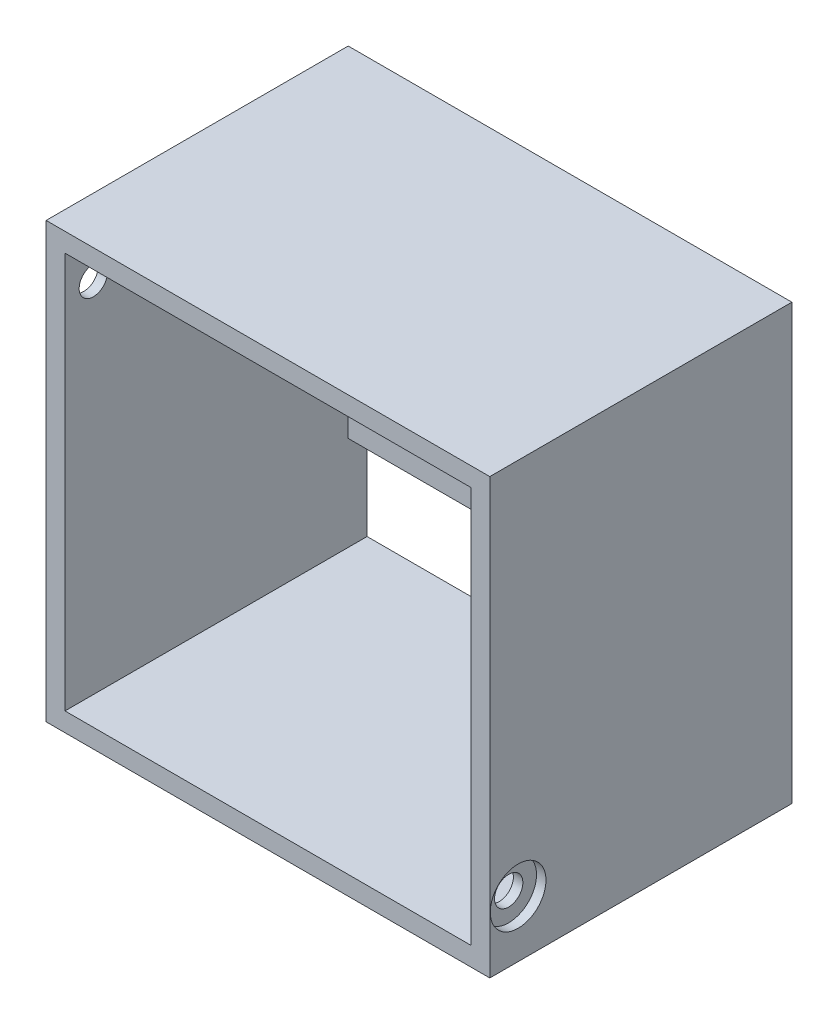
ISO-10303-21;
HEADER;
FILE_DESCRIPTION(('STEP AP214'),'2;1');
FILE_NAME('part.step','',(''),(''),'','','');
FILE_SCHEMA(('AUTOMOTIVE_DESIGN { 1 0 10303 214 1 1 1 1 }'));
ENDSEC;
DATA;
#1=APPLICATION_CONTEXT('core data for automotive mechanical design processes');
#2=APPLICATION_PROTOCOL_DEFINITION('international standard','automotive_design',2000,#1);
#3=PRODUCT_CONTEXT('',#1,'mechanical');
#4=PRODUCT('Part','Part','',(#3));
#5=PRODUCT_RELATED_PRODUCT_CATEGORY('part','',(#4));
#6=PRODUCT_DEFINITION_FORMATION('','',#4);
#7=PRODUCT_DEFINITION_CONTEXT('part definition',#1,'design');
#8=PRODUCT_DEFINITION('design','',#6,#7);
#9=PRODUCT_DEFINITION_SHAPE('','',#8);
#10=(LENGTH_UNIT() NAMED_UNIT(*) SI_UNIT(.MILLI.,.METRE.));
#11=(NAMED_UNIT(*) PLANE_ANGLE_UNIT() SI_UNIT($,.RADIAN.));
#12=(NAMED_UNIT(*) SI_UNIT($,.STERADIAN.) SOLID_ANGLE_UNIT());
#13=UNCERTAINTY_MEASURE_WITH_UNIT(LENGTH_MEASURE(1.E-05),#10,'distance_accuracy_value','');
#14=(GEOMETRIC_REPRESENTATION_CONTEXT(3) GLOBAL_UNCERTAINTY_ASSIGNED_CONTEXT((#13)) GLOBAL_UNIT_ASSIGNED_CONTEXT((#10,
#11,#12)) REPRESENTATION_CONTEXT('',''));
#15=CARTESIAN_POINT('',(0.,0.,0.));
#16=DIRECTION('',(0.,0.,1.));
#17=DIRECTION('',(1.,0.,0.));
#18=AXIS2_PLACEMENT_3D('',#15,#16,#17);
#19=CARTESIAN_POINT('',(0.,0.,-2.));
#20=DIRECTION('',(0.,0.,1.));
#21=DIRECTION('',(1.,0.,0.));
#22=AXIS2_PLACEMENT_3D('',#19,#20,#21);
#23=PLANE('',#22);
#24=DIRECTION('',(0.,-1.,0.));
#25=VECTOR('',#24,1.);
#26=CARTESIAN_POINT('',(5.32459951083855,0.,-2.));
#27=LINE('',#26,#25);
#28=CARTESIAN_POINT('',(5.32459951083854,62.7227901272873,-2.));
#29=VERTEX_POINT('',#28);
#30=CARTESIAN_POINT('',(5.32459951083854,16.7227901272873,-2.));
#31=VERTEX_POINT('',#30);
#32=EDGE_CURVE('E218',#29,#31,#27,.T.);
#33=ORIENTED_EDGE('',*,*,#32,.T.);
#34=DIRECTION('',(1.,0.,0.));
#35=VECTOR('',#34,1.);
#36=CARTESIAN_POINT('',(0.,16.7227901272873,-2.));
#37=LINE('',#36,#35);
#38=CARTESIAN_POINT('',(-41.6754004891615,16.7227901272873,-2.));
#39=VERTEX_POINT('',#38);
#40=EDGE_CURVE('E231',#39,#31,#37,.T.);
#41=ORIENTED_EDGE('',*,*,#40,.F.);
#42=DIRECTION('',(0.,-1.,0.));
#43=VECTOR('',#42,1.);
#44=CARTESIAN_POINT('',(-41.6754004891615,0.,-2.));
#45=LINE('',#44,#43);
#46=CARTESIAN_POINT('',(-41.6754004891615,62.7227901272873,-2.));
#47=VERTEX_POINT('',#46);
#48=EDGE_CURVE('E228',#47,#39,#45,.T.);
#49=ORIENTED_EDGE('',*,*,#48,.F.);
#50=DIRECTION('',(1.,0.,0.));
#51=VECTOR('',#50,1.);
#52=CARTESIAN_POINT('',(0.,62.7227901272873,-2.));
#53=LINE('',#52,#51);
#54=EDGE_CURVE('E225',#47,#29,#53,.T.);
#55=ORIENTED_EDGE('',*,*,#54,.T.);
#56=EDGE_LOOP('',(#33,#41,#49,#55));
#57=FACE_BOUND('',#56,.T.);
#58=DIRECTION('',(-1.,0.,0.));
#59=VECTOR('',#58,1.);
#60=CARTESIAN_POINT('',(-24.6754004891615,18.7227901272873,-2.));
#61=LINE('',#60,#59);
#62=CARTESIAN_POINT('',(-24.6754004891615,18.7227901272873,-2.));
#63=VERTEX_POINT('',#62);
#64=CARTESIAN_POINT('',(-39.6754004891615,18.7227901272873,-2.));
#65=VERTEX_POINT('',#64);
#66=EDGE_CURVE('E208',#63,#65,#61,.T.);
#67=ORIENTED_EDGE('',*,*,#66,.F.);
#68=DIRECTION('',(0.,-1.,0.));
#69=VECTOR('',#68,1.);
#70=CARTESIAN_POINT('',(-24.6754004891615,28.7227901272873,-2.));
#71=LINE('',#70,#69);
#72=CARTESIAN_POINT('',(-24.6754004891615,28.7227901272873,-2.));
#73=VERTEX_POINT('',#72);
#74=EDGE_CURVE('E198',#73,#63,#71,.T.);
#75=ORIENTED_EDGE('',*,*,#74,.F.);
#76=DIRECTION('',(1.,0.,0.));
#77=VECTOR('',#76,1.);
#78=CARTESIAN_POINT('',(-24.6754004891615,28.7227901272873,-2.));
#79=LINE('',#78,#77);
#80=CARTESIAN_POINT('',(-39.6754004891615,28.7227901272873,-2.));
#81=VERTEX_POINT('',#80);
#82=EDGE_CURVE('E203',#81,#73,#79,.T.);
#83=ORIENTED_EDGE('',*,*,#82,.F.);
#84=DIRECTION('',(0.,1.,0.));
#85=VECTOR('',#84,1.);
#86=CARTESIAN_POINT('',(-39.6754004891615,28.7227901272873,-2.));
#87=LINE('',#86,#85);
#88=EDGE_CURVE('E211',#65,#81,#87,.T.);
#89=ORIENTED_EDGE('',*,*,#88,.F.);
#90=EDGE_LOOP('',(#67,#75,#83,#89));
#91=FACE_BOUND('',#90,.T.);
#92=DIRECTION('',(0.,-1.,0.));
#93=VECTOR('',#92,1.);
#94=CARTESIAN_POINT('',(-14.1754004891615,39.7227901272873,-2.));
#95=LINE('',#94,#93);
#96=CARTESIAN_POINT('',(-14.1754004891615,39.7227901272873,-2.));
#97=VERTEX_POINT('',#96);
#98=CARTESIAN_POINT('',(-14.1754004891615,29.7227901272873,-2.));
#99=VERTEX_POINT('',#98);
#100=EDGE_CURVE('E168',#97,#99,#95,.T.);
#101=ORIENTED_EDGE('',*,*,#100,.F.);
#102=DIRECTION('',(1.,0.,0.));
#103=VECTOR('',#102,1.);
#104=CARTESIAN_POINT('',(-14.1754004891615,39.7227901272873,-2.));
#105=LINE('',#104,#103);
#106=CARTESIAN_POINT('',(-22.1754004891615,39.7227901272873,-2.));
#107=VERTEX_POINT('',#106);
#108=EDGE_CURVE('E165',#107,#97,#105,.T.);
#109=ORIENTED_EDGE('',*,*,#108,.F.);
#110=DIRECTION('',(0.,1.,0.));
#111=VECTOR('',#110,1.);
#112=CARTESIAN_POINT('',(-22.1754004891615,39.7227901272873,-2.));
#113=LINE('',#112,#111);
#114=CARTESIAN_POINT('',(-22.1754004891615,29.7227901272873,-2.));
#115=VERTEX_POINT('',#114);
#116=EDGE_CURVE('E62',#115,#107,#113,.T.);
#117=ORIENTED_EDGE('',*,*,#116,.F.);
#118=DIRECTION('',(-1.,0.,0.));
#119=VECTOR('',#118,1.);
#120=CARTESIAN_POINT('',(-14.1754004891615,29.7227901272873,-2.));
#121=LINE('',#120,#119);
#122=EDGE_CURVE('E57',#99,#115,#121,.T.);
#123=ORIENTED_EDGE('',*,*,#122,.F.);
#124=EDGE_LOOP('',(#101,#109,#117,#123));
#125=FACE_BOUND('',#124,.T.);
#126=ADVANCED_FACE('F42',(#57,#91,#125),#23,.F.);
#127=CARTESIAN_POINT('',(-39.6754004891615,56.7125325626212,27.));
#128=DIRECTION('',(-1.,0.,0.));
#129=DIRECTION('',(0.,-1.,0.));
#130=AXIS2_PLACEMENT_3D('',#127,#128,#129);
#131=CYLINDRICAL_SURFACE('',#130,1.5);
#132=CARTESIAN_POINT('',(-39.6754004891615,56.7125325626212,27.));
#133=DIRECTION('',(-1.,0.,0.));
#134=DIRECTION('',(0.,-1.,0.));
#135=AXIS2_PLACEMENT_3D('',#132,#133,#134);
#136=CIRCLE('',#135,1.5);
#137=CARTESIAN_POINT('',(-39.6754004891615,55.2125325626212,27.));
#138=VERTEX_POINT('',#137);
#139=EDGE_CURVE('E193',#138,#138,#136,.T.);
#140=ORIENTED_EDGE('',*,*,#139,.F.);
#141=EDGE_LOOP('',(#140));
#142=FACE_BOUND('',#141,.T.);
#143=CARTESIAN_POINT('',(-40.6754004891615,56.7125325626212,27.));
#144=DIRECTION('',(-1.,0.,0.));
#145=DIRECTION('',(0.,-1.,0.));
#146=AXIS2_PLACEMENT_3D('',#143,#144,#145);
#147=CIRCLE('',#146,1.5);
#148=CARTESIAN_POINT('',(-40.6754004891615,55.2125325626212,27.));
#149=VERTEX_POINT('',#148);
#150=EDGE_CURVE('E187',#149,#149,#147,.T.);
#151=ORIENTED_EDGE('',*,*,#150,.T.);
#152=EDGE_LOOP('',(#151));
#153=FACE_BOUND('',#152,.T.);
#154=ADVANCED_FACE('F340',(#142,#153),#131,.F.);
#155=CARTESIAN_POINT('',(0.,0.,0.));
#156=DIRECTION('',(0.,0.,1.));
#157=DIRECTION('',(1.,0.,0.));
#158=AXIS2_PLACEMENT_3D('',#155,#156,#157);
#159=PLANE('',#158);
#160=DIRECTION('',(1.,0.,0.));
#161=VECTOR('',#160,1.);
#162=CARTESIAN_POINT('',(-24.6754004891615,28.7227901272873,0.));
#163=LINE('',#162,#161);
#164=CARTESIAN_POINT('',(-39.6754004891615,28.7227901272873,0.));
#165=VERTEX_POINT('',#164);
#166=CARTESIAN_POINT('',(-24.6754004891615,28.7227901272873,0.));
#167=VERTEX_POINT('',#166);
#168=EDGE_CURVE('E202',#165,#167,#163,.T.);
#169=ORIENTED_EDGE('',*,*,#168,.T.);
#170=DIRECTION('',(0.,-1.,0.));
#171=VECTOR('',#170,1.);
#172=CARTESIAN_POINT('',(-24.6754004891615,28.7227901272873,0.));
#173=LINE('',#172,#171);
#174=CARTESIAN_POINT('',(-24.6754004891615,18.7227901272873,0.));
#175=VERTEX_POINT('',#174);
#176=EDGE_CURVE('E199',#167,#175,#173,.T.);
#177=ORIENTED_EDGE('',*,*,#176,.T.);
#178=DIRECTION('',(1.,0.,0.));
#179=VECTOR('',#178,1.);
#180=CARTESIAN_POINT('',(-39.6754004891615,18.7227901272873,0.));
#181=LINE('',#180,#179);
#182=CARTESIAN_POINT('',(3.32459951083854,18.7227901272873,0.));
#183=VERTEX_POINT('',#182);
#184=EDGE_CURVE('E248',#175,#183,#181,.T.);
#185=ORIENTED_EDGE('',*,*,#184,.T.);
#186=DIRECTION('',(0.,1.,0.));
#187=VECTOR('',#186,1.);
#188=CARTESIAN_POINT('',(3.32459951083854,60.7227901272873,0.));
#189=LINE('',#188,#187);
#190=CARTESIAN_POINT('',(3.32459951083854,60.7227901272873,0.));
#191=VERTEX_POINT('',#190);
#192=EDGE_CURVE('E250',#183,#191,#189,.T.);
#193=ORIENTED_EDGE('',*,*,#192,.T.);
#194=DIRECTION('',(-1.,0.,0.));
#195=VECTOR('',#194,1.);
#196=CARTESIAN_POINT('',(-39.6754004891615,60.7227901272873,0.));
#197=LINE('',#196,#195);
#198=CARTESIAN_POINT('',(-39.6754004891615,60.7227901272873,0.));
#199=VERTEX_POINT('',#198);
#200=EDGE_CURVE('E238',#191,#199,#197,.T.);
#201=ORIENTED_EDGE('',*,*,#200,.T.);
#202=DIRECTION('',(0.,-1.,0.));
#203=VECTOR('',#202,1.);
#204=CARTESIAN_POINT('',(-39.6754004891615,60.7227901272873,0.));
#205=LINE('',#204,#203);
#206=EDGE_CURVE('E234',#199,#165,#205,.T.);
#207=ORIENTED_EDGE('',*,*,#206,.T.);
#208=EDGE_LOOP('',(#169,#177,#185,#193,#201,#207));
#209=FACE_BOUND('',#208,.T.);
#210=ADVANCED_FACE('F299',(#209),#159,.T.);
#211=CARTESIAN_POINT('',(0.,0.,30.));
#212=DIRECTION('',(0.,0.,1.));
#213=DIRECTION('',(1.,0.,0.));
#214=AXIS2_PLACEMENT_3D('',#211,#212,#213);
#215=PLANE('',#214);
#216=DIRECTION('',(0.,-1.,0.));
#217=VECTOR('',#216,1.);
#218=CARTESIAN_POINT('',(-41.6754004891615,62.7227901272873,30.));
#219=LINE('',#218,#217);
#220=CARTESIAN_POINT('',(-41.6754004891615,62.7227901272873,30.));
#221=VERTEX_POINT('',#220);
#222=CARTESIAN_POINT('',(-41.6754004891615,16.7227901272873,30.));
#223=VERTEX_POINT('',#222);
#224=EDGE_CURVE('E263',#221,#223,#219,.T.);
#225=ORIENTED_EDGE('',*,*,#224,.T.);
#226=DIRECTION('',(1.,0.,0.));
#227=VECTOR('',#226,1.);
#228=CARTESIAN_POINT('',(-41.6754004891615,16.7227901272873,30.));
#229=LINE('',#228,#227);
#230=CARTESIAN_POINT('',(5.32459951083854,16.7227901272873,30.));
#231=VERTEX_POINT('',#230);
#232=EDGE_CURVE('E266',#223,#231,#229,.T.);
#233=ORIENTED_EDGE('',*,*,#232,.T.);
#234=DIRECTION('',(0.,1.,0.));
#235=VECTOR('',#234,1.);
#236=CARTESIAN_POINT('',(5.32459951083854,62.7227901272873,30.));
#237=LINE('',#236,#235);
#238=CARTESIAN_POINT('',(5.32459951083854,62.7227901272873,30.));
#239=VERTEX_POINT('',#238);
#240=EDGE_CURVE('E268',#231,#239,#237,.T.);
#241=ORIENTED_EDGE('',*,*,#240,.T.);
#242=DIRECTION('',(-1.,0.,0.));
#243=VECTOR('',#242,1.);
#244=CARTESIAN_POINT('',(-41.6754004891615,62.7227901272873,30.));
#245=LINE('',#244,#243);
#246=EDGE_CURVE('E270',#239,#221,#245,.T.);
#247=ORIENTED_EDGE('',*,*,#246,.T.);
#248=EDGE_LOOP('',(#225,#233,#241,#247));
#249=FACE_BOUND('',#248,.T.);
#250=DIRECTION('',(1.,0.,0.));
#251=VECTOR('',#250,1.);
#252=CARTESIAN_POINT('',(-39.6754004891615,18.7227901272873,30.));
#253=LINE('',#252,#251);
#254=CARTESIAN_POINT('',(-39.6754004891615,18.7227901272873,30.));
#255=VERTEX_POINT('',#254);
#256=CARTESIAN_POINT('',(3.32459951083854,18.7227901272873,30.));
#257=VERTEX_POINT('',#256);
#258=EDGE_CURVE('E237',#255,#257,#253,.T.);
#259=ORIENTED_EDGE('',*,*,#258,.F.);
#260=DIRECTION('',(0.,-1.,0.));
#261=VECTOR('',#260,1.);
#262=CARTESIAN_POINT('',(-39.6754004891615,60.7227901272873,30.));
#263=LINE('',#262,#261);
#264=CARTESIAN_POINT('',(-39.6754004891615,60.7227901272873,30.));
#265=VERTEX_POINT('',#264);
#266=EDGE_CURVE('E235',#265,#255,#263,.T.);
#267=ORIENTED_EDGE('',*,*,#266,.F.);
#268=DIRECTION('',(-1.,0.,0.));
#269=VECTOR('',#268,1.);
#270=CARTESIAN_POINT('',(-39.6754004891615,60.7227901272873,30.));
#271=LINE('',#270,#269);
#272=CARTESIAN_POINT('',(3.32459951083854,60.7227901272873,30.));
#273=VERTEX_POINT('',#272);
#274=EDGE_CURVE('E243',#273,#265,#271,.T.);
#275=ORIENTED_EDGE('',*,*,#274,.F.);
#276=DIRECTION('',(0.,1.,0.));
#277=VECTOR('',#276,1.);
#278=CARTESIAN_POINT('',(3.32459951083854,60.7227901272873,30.));
#279=LINE('',#278,#277);
#280=EDGE_CURVE('E240',#257,#273,#279,.T.);
#281=ORIENTED_EDGE('',*,*,#280,.F.);
#282=EDGE_LOOP('',(#259,#267,#275,#281));
#283=FACE_BOUND('',#282,.T.);
#284=ADVANCED_FACE('F296',(#249,#283),#215,.T.);
#285=CARTESIAN_POINT('',(-41.6754004891615,62.7227901272873,30.));
#286=DIRECTION('',(1.,0.,0.));
#287=DIRECTION('',(0.,1.,0.));
#288=AXIS2_PLACEMENT_3D('',#285,#286,#287);
#289=PLANE('',#288);
#290=CARTESIAN_POINT('',(-41.6754004891615,56.7125325626212,27.));
#291=DIRECTION('',(-1.,0.,0.));
#292=DIRECTION('',(0.,-1.,0.));
#293=AXIS2_PLACEMENT_3D('',#290,#291,#292);
#294=CIRCLE('',#293,2.95);
#295=CARTESIAN_POINT('',(-41.6754004891615,53.7625325626212,27.));
#296=VERTEX_POINT('',#295);
#297=EDGE_CURVE('E184',#296,#296,#294,.T.);
#298=ORIENTED_EDGE('',*,*,#297,.F.);
#299=EDGE_LOOP('',(#298));
#300=FACE_BOUND('',#299,.T.);
#301=DIRECTION('',(0.,0.,-1.));
#302=VECTOR('',#301,1.);
#303=CARTESIAN_POINT('',(-41.6754004891615,62.7227901272873,30.));
#304=LINE('',#303,#302);
#305=EDGE_CURVE('E272',#221,#47,#304,.T.);
#306=ORIENTED_EDGE('',*,*,#305,.T.);
#307=ORIENTED_EDGE('',*,*,#48,.T.);
#308=DIRECTION('',(0.,0.,-1.));
#309=VECTOR('',#308,1.);
#310=CARTESIAN_POINT('',(-41.6754004891615,16.7227901272873,30.));
#311=LINE('',#310,#309);
#312=EDGE_CURVE('E12',#223,#39,#311,.T.);
#313=ORIENTED_EDGE('',*,*,#312,.F.);
#314=ORIENTED_EDGE('',*,*,#224,.F.);
#315=EDGE_LOOP('',(#306,#307,#313,#314));
#316=FACE_BOUND('',#315,.T.);
#317=ADVANCED_FACE('F44',(#300,#316),#289,.F.);
#318=CARTESIAN_POINT('',(-41.6754004891615,16.7227901272873,30.));
#319=DIRECTION('',(0.,1.,0.));
#320=DIRECTION('',(0.,0.,1.));
#321=AXIS2_PLACEMENT_3D('',#318,#319,#320);
#322=PLANE('',#321);
#323=ORIENTED_EDGE('',*,*,#312,.T.);
#324=ORIENTED_EDGE('',*,*,#40,.T.);
#325=DIRECTION('',(0.,0.,-1.));
#326=VECTOR('',#325,1.);
#327=CARTESIAN_POINT('',(5.32459951083854,16.7227901272873,30.));
#328=LINE('',#327,#326);
#329=EDGE_CURVE('E50',#231,#31,#328,.T.);
#330=ORIENTED_EDGE('',*,*,#329,.F.);
#331=ORIENTED_EDGE('',*,*,#232,.F.);
#332=EDGE_LOOP('',(#323,#324,#330,#331));
#333=FACE_BOUND('',#332,.T.);
#334=ADVANCED_FACE('F287',(#333),#322,.F.);
#335=CARTESIAN_POINT('',(5.32459951083854,62.7227901272873,30.));
#336=DIRECTION('',(-1.,0.,0.));
#337=DIRECTION('',(0.,-1.,0.));
#338=AXIS2_PLACEMENT_3D('',#335,#336,#337);
#339=PLANE('',#338);
#340=CARTESIAN_POINT('',(5.32459951083854,22.7330476919534,27.));
#341=DIRECTION('',(-1.,0.,0.));
#342=DIRECTION('',(0.,-1.,0.));
#343=AXIS2_PLACEMENT_3D('',#340,#341,#342);
#344=CIRCLE('',#343,2.95);
#345=CARTESIAN_POINT('',(5.32459951083854,19.7830476919534,27.));
#346=VERTEX_POINT('',#345);
#347=EDGE_CURVE('E180',#346,#346,#344,.T.);
#348=ORIENTED_EDGE('',*,*,#347,.T.);
#349=EDGE_LOOP('',(#348));
#350=FACE_BOUND('',#349,.T.);
#351=ORIENTED_EDGE('',*,*,#329,.T.);
#352=ORIENTED_EDGE('',*,*,#32,.F.);
#353=DIRECTION('',(0.,0.,-1.));
#354=VECTOR('',#353,1.);
#355=CARTESIAN_POINT('',(5.32459951083854,62.7227901272873,30.));
#356=LINE('',#355,#354);
#357=EDGE_CURVE('E274',#239,#29,#356,.T.);
#358=ORIENTED_EDGE('',*,*,#357,.F.);
#359=ORIENTED_EDGE('',*,*,#240,.F.);
#360=EDGE_LOOP('',(#351,#352,#358,#359));
#361=FACE_BOUND('',#360,.T.);
#362=ADVANCED_FACE('F279',(#350,#361),#339,.F.);
#363=CARTESIAN_POINT('',(-41.6754004891615,62.7227901272873,30.));
#364=DIRECTION('',(0.,-1.,0.));
#365=DIRECTION('',(0.,0.,-1.));
#366=AXIS2_PLACEMENT_3D('',#363,#364,#365);
#367=PLANE('',#366);
#368=ORIENTED_EDGE('',*,*,#357,.T.);
#369=ORIENTED_EDGE('',*,*,#54,.F.);
#370=ORIENTED_EDGE('',*,*,#305,.F.);
#371=ORIENTED_EDGE('',*,*,#246,.F.);
#372=EDGE_LOOP('',(#368,#369,#370,#371));
#373=FACE_BOUND('',#372,.T.);
#374=ADVANCED_FACE('F294',(#373),#367,.F.);
#375=CARTESIAN_POINT('',(-39.6754004891615,60.7227901272873,30.));
#376=DIRECTION('',(1.,0.,0.));
#377=DIRECTION('',(0.,1.,0.));
#378=AXIS2_PLACEMENT_3D('',#375,#376,#377);
#379=PLANE('',#378);
#380=ORIENTED_EDGE('',*,*,#139,.T.);
#381=EDGE_LOOP('',(#380));
#382=FACE_BOUND('',#381,.T.);
#383=ORIENTED_EDGE('',*,*,#206,.F.);
#384=DIRECTION('',(0.,0.,-1.));
#385=VECTOR('',#384,1.);
#386=CARTESIAN_POINT('',(-39.6754004891615,60.7227901272873,30.));
#387=LINE('',#386,#385);
#388=EDGE_CURVE('E245',#265,#199,#387,.T.);
#389=ORIENTED_EDGE('',*,*,#388,.F.);
#390=ORIENTED_EDGE('',*,*,#266,.T.);
#391=DIRECTION('',(0.,0.,-1.));
#392=VECTOR('',#391,1.);
#393=CARTESIAN_POINT('',(-39.6754004891615,18.7227901272873,30.));
#394=LINE('',#393,#392);
#395=EDGE_CURVE('E261',#255,#65,#394,.T.);
#396=ORIENTED_EDGE('',*,*,#395,.T.);
#397=ORIENTED_EDGE('',*,*,#88,.T.);
#398=DIRECTION('',(0.,0.,-1.));
#399=VECTOR('',#398,1.);
#400=CARTESIAN_POINT('',(-39.6754004891615,28.7227901272873,0.));
#401=LINE('',#400,#399);
#402=EDGE_CURVE('E219',#165,#81,#401,.T.);
#403=ORIENTED_EDGE('',*,*,#402,.F.);
#404=EDGE_LOOP('',(#383,#389,#390,#396,#397,#403));
#405=FACE_BOUND('',#404,.T.);
#406=ADVANCED_FACE('F322',(#382,#405),#379,.T.);
#407=CARTESIAN_POINT('',(-39.6754004891615,18.7227901272873,30.));
#408=DIRECTION('',(0.,1.,0.));
#409=DIRECTION('',(0.,0.,1.));
#410=AXIS2_PLACEMENT_3D('',#407,#408,#409);
#411=PLANE('',#410);
#412=ORIENTED_EDGE('',*,*,#184,.F.);
#413=DIRECTION('',(0.,0.,-1.));
#414=VECTOR('',#413,1.);
#415=CARTESIAN_POINT('',(-24.6754004891615,18.7227901272873,0.));
#416=LINE('',#415,#414);
#417=EDGE_CURVE('E206',#175,#63,#416,.T.);
#418=ORIENTED_EDGE('',*,*,#417,.T.);
#419=ORIENTED_EDGE('',*,*,#66,.T.);
#420=ORIENTED_EDGE('',*,*,#395,.F.);
#421=ORIENTED_EDGE('',*,*,#258,.T.);
#422=DIRECTION('',(0.,0.,-1.));
#423=VECTOR('',#422,1.);
#424=CARTESIAN_POINT('',(3.32459951083854,18.7227901272873,30.));
#425=LINE('',#424,#423);
#426=EDGE_CURVE('E258',#257,#183,#425,.T.);
#427=ORIENTED_EDGE('',*,*,#426,.T.);
#428=EDGE_LOOP('',(#412,#418,#419,#420,#421,#427));
#429=FACE_BOUND('',#428,.T.);
#430=ADVANCED_FACE('F309',(#429),#411,.T.);
#431=CARTESIAN_POINT('',(3.32459951083854,60.7227901272873,30.));
#432=DIRECTION('',(-1.,0.,0.));
#433=DIRECTION('',(0.,-1.,0.));
#434=AXIS2_PLACEMENT_3D('',#431,#432,#433);
#435=PLANE('',#434);
#436=CARTESIAN_POINT('',(3.32459951083854,22.7330476919534,27.));
#437=DIRECTION('',(-1.,0.,0.));
#438=DIRECTION('',(0.,-1.,0.));
#439=AXIS2_PLACEMENT_3D('',#436,#437,#438);
#440=CIRCLE('',#439,1.5);
#441=CARTESIAN_POINT('',(3.32459951083854,21.2330476919534,27.));
#442=VERTEX_POINT('',#441);
#443=EDGE_CURVE('E169',#442,#442,#440,.T.);
#444=ORIENTED_EDGE('',*,*,#443,.F.);
#445=EDGE_LOOP('',(#444));
#446=FACE_BOUND('',#445,.T.);
#447=ORIENTED_EDGE('',*,*,#192,.F.);
#448=ORIENTED_EDGE('',*,*,#426,.F.);
#449=ORIENTED_EDGE('',*,*,#280,.T.);
#450=DIRECTION('',(0.,0.,-1.));
#451=VECTOR('',#450,1.);
#452=CARTESIAN_POINT('',(3.32459951083854,60.7227901272873,30.));
#453=LINE('',#452,#451);
#454=EDGE_CURVE('E256',#273,#191,#453,.T.);
#455=ORIENTED_EDGE('',*,*,#454,.T.);
#456=EDGE_LOOP('',(#447,#448,#449,#455));
#457=FACE_BOUND('',#456,.T.);
#458=ADVANCED_FACE('F312',(#446,#457),#435,.T.);
#459=CARTESIAN_POINT('',(-39.6754004891615,60.7227901272873,30.));
#460=DIRECTION('',(0.,-1.,0.));
#461=DIRECTION('',(0.,0.,-1.));
#462=AXIS2_PLACEMENT_3D('',#459,#460,#461);
#463=PLANE('',#462);
#464=ORIENTED_EDGE('',*,*,#200,.F.);
#465=ORIENTED_EDGE('',*,*,#454,.F.);
#466=ORIENTED_EDGE('',*,*,#274,.T.);
#467=ORIENTED_EDGE('',*,*,#388,.T.);
#468=EDGE_LOOP('',(#464,#465,#466,#467));
#469=FACE_BOUND('',#468,.T.);
#470=ADVANCED_FACE('F326',(#469),#463,.T.);
#471=CARTESIAN_POINT('',(-24.6754004891615,28.7227901272873,0.));
#472=DIRECTION('',(1.,0.,0.));
#473=DIRECTION('',(0.,0.,-1.));
#474=AXIS2_PLACEMENT_3D('',#471,#472,#473);
#475=PLANE('',#474);
#476=ORIENTED_EDGE('',*,*,#74,.T.);
#477=ORIENTED_EDGE('',*,*,#417,.F.);
#478=ORIENTED_EDGE('',*,*,#176,.F.);
#479=DIRECTION('',(0.,0.,-1.));
#480=VECTOR('',#479,1.);
#481=CARTESIAN_POINT('',(-24.6754004891615,28.7227901272873,0.));
#482=LINE('',#481,#480);
#483=EDGE_CURVE('E216',#167,#73,#482,.T.);
#484=ORIENTED_EDGE('',*,*,#483,.T.);
#485=EDGE_LOOP('',(#476,#477,#478,#484));
#486=FACE_BOUND('',#485,.T.);
#487=ADVANCED_FACE('F328',(#486),#475,.F.);
#488=CARTESIAN_POINT('',(-24.6754004891615,28.7227901272873,0.));
#489=DIRECTION('',(0.,1.,0.));
#490=DIRECTION('',(0.,0.,1.));
#491=AXIS2_PLACEMENT_3D('',#488,#489,#490);
#492=PLANE('',#491);
#493=ORIENTED_EDGE('',*,*,#82,.T.);
#494=ORIENTED_EDGE('',*,*,#483,.F.);
#495=ORIENTED_EDGE('',*,*,#168,.F.);
#496=ORIENTED_EDGE('',*,*,#402,.T.);
#497=EDGE_LOOP('',(#493,#494,#495,#496));
#498=FACE_BOUND('',#497,.T.);
#499=ADVANCED_FACE('F334',(#498),#492,.F.);
#500=CARTESIAN_POINT('',(-40.6754004891615,56.7125325626212,27.));
#501=DIRECTION('',(-1.,0.,0.));
#502=DIRECTION('',(0.,-1.,0.));
#503=AXIS2_PLACEMENT_3D('',#500,#501,#502);
#504=CYLINDRICAL_SURFACE('',#503,2.95);
#505=CARTESIAN_POINT('',(-40.6754004891615,56.7125325626212,27.));
#506=DIRECTION('',(-1.,0.,0.));
#507=DIRECTION('',(0.,-1.,0.));
#508=AXIS2_PLACEMENT_3D('',#505,#506,#507);
#509=CIRCLE('',#508,2.95);
#510=CARTESIAN_POINT('',(-40.6754004891615,53.7625325626212,27.));
#511=VERTEX_POINT('',#510);
#512=EDGE_CURVE('E190',#511,#511,#509,.T.);
#513=ORIENTED_EDGE('',*,*,#512,.F.);
#514=EDGE_LOOP('',(#513));
#515=FACE_BOUND('',#514,.T.);
#516=ORIENTED_EDGE('',*,*,#297,.T.);
#517=EDGE_LOOP('',(#516));
#518=FACE_BOUND('',#517,.T.);
#519=ADVANCED_FACE('F495',(#515,#518),#504,.F.);
#520=CARTESIAN_POINT('',(-40.6754004891615,0.,0.));
#521=DIRECTION('',(-1.,0.,0.));
#522=DIRECTION('',(0.,-1.,0.));
#523=AXIS2_PLACEMENT_3D('',#520,#521,#522);
#524=PLANE('',#523);
#525=ORIENTED_EDGE('',*,*,#150,.F.);
#526=EDGE_LOOP('',(#525));
#527=FACE_BOUND('',#526,.T.);
#528=ORIENTED_EDGE('',*,*,#512,.T.);
#529=EDGE_LOOP('',(#528));
#530=FACE_BOUND('',#529,.T.);
#531=ADVANCED_FACE('F489',(#527,#530),#524,.T.);
#532=CARTESIAN_POINT('',(4.32459951083854,22.7330476919534,27.));
#533=DIRECTION('',(-1.,0.,0.));
#534=DIRECTION('',(0.,-1.,0.));
#535=AXIS2_PLACEMENT_3D('',#532,#533,#534);
#536=PLANE('',#535);
#537=CARTESIAN_POINT('',(4.32459951083854,22.7330476919534,27.));
#538=DIRECTION('',(-1.,0.,0.));
#539=DIRECTION('',(0.,-1.,0.));
#540=AXIS2_PLACEMENT_3D('',#537,#538,#539);
#541=CIRCLE('',#540,2.95);
#542=CARTESIAN_POINT('',(4.32459951083854,19.7830476919534,27.));
#543=VERTEX_POINT('',#542);
#544=EDGE_CURVE('E181',#543,#543,#541,.T.);
#545=ORIENTED_EDGE('',*,*,#544,.F.);
#546=EDGE_LOOP('',(#545));
#547=FACE_BOUND('',#546,.T.);
#548=CARTESIAN_POINT('',(4.32459951083854,22.7330476919534,27.));
#549=DIRECTION('',(-1.,0.,0.));
#550=DIRECTION('',(0.,-1.,0.));
#551=AXIS2_PLACEMENT_3D('',#548,#549,#550);
#552=CIRCLE('',#551,1.5);
#553=CARTESIAN_POINT('',(4.32459951083854,21.2330476919534,27.));
#554=VERTEX_POINT('',#553);
#555=EDGE_CURVE('E172',#554,#554,#552,.F.);
#556=ORIENTED_EDGE('',*,*,#555,.F.);
#557=EDGE_LOOP('',(#556));
#558=FACE_BOUND('',#557,.T.);
#559=ADVANCED_FACE('F486',(#547,#558),#536,.F.);
#560=CARTESIAN_POINT('',(4.32459951083854,22.7330476919534,27.));
#561=DIRECTION('',(1.,0.,0.));
#562=DIRECTION('',(0.,1.,0.));
#563=AXIS2_PLACEMENT_3D('',#560,#561,#562);
#564=CYLINDRICAL_SURFACE('',#563,2.95);
#565=ORIENTED_EDGE('',*,*,#544,.T.);
#566=EDGE_LOOP('',(#565));
#567=FACE_BOUND('',#566,.T.);
#568=ORIENTED_EDGE('',*,*,#347,.F.);
#569=EDGE_LOOP('',(#568));
#570=FACE_BOUND('',#569,.T.);
#571=ADVANCED_FACE('F411',(#567,#570),#564,.F.);
#572=CARTESIAN_POINT('',(3.32459951083854,22.7330476919534,27.));
#573=DIRECTION('',(1.,0.,0.));
#574=DIRECTION('',(0.,1.,0.));
#575=AXIS2_PLACEMENT_3D('',#572,#573,#574);
#576=CYLINDRICAL_SURFACE('',#575,1.5);
#577=ORIENTED_EDGE('',*,*,#443,.T.);
#578=EDGE_LOOP('',(#577));
#579=FACE_BOUND('',#578,.T.);
#580=ORIENTED_EDGE('',*,*,#555,.T.);
#581=EDGE_LOOP('',(#580));
#582=FACE_BOUND('',#581,.T.);
#583=ADVANCED_FACE('F415',(#579,#582),#576,.F.);
#584=CARTESIAN_POINT('',(-14.1754004891615,39.7227901272873,-17.));
#585=DIRECTION('',(-1.,0.,0.));
#586=DIRECTION('',(0.,0.,1.));
#587=AXIS2_PLACEMENT_3D('',#584,#585,#586);
#588=PLANE('',#587);
#589=CARTESIAN_POINT('',(-14.1754004891615,34.7227901272873,-12.));
#590=DIRECTION('',(-1.,0.,0.));
#591=DIRECTION('',(0.,0.,1.));
#592=AXIS2_PLACEMENT_3D('',#589,#590,#591);
#593=CIRCLE('',#592,2.5);
#594=CARTESIAN_POINT('',(-14.1754004891615,34.7227901272873,-9.50000000000001));
#595=VERTEX_POINT('',#594);
#596=EDGE_CURVE('E586',#595,#595,#593,.T.);
#597=ORIENTED_EDGE('',*,*,#596,.T.);
#598=EDGE_LOOP('',(#597));
#599=FACE_BOUND('',#598,.T.);
#600=ORIENTED_EDGE('',*,*,#100,.T.);
#601=DIRECTION('',(0.,0.,1.));
#602=VECTOR('',#601,1.);
#603=CARTESIAN_POINT('',(-14.1754004891615,29.7227901272873,-17.));
#604=LINE('',#603,#602);
#605=CARTESIAN_POINT('',(-14.1754004891615,29.7227901272873,-17.));
#606=VERTEX_POINT('',#605);
#607=EDGE_CURVE('E149',#606,#99,#604,.T.);
#608=ORIENTED_EDGE('',*,*,#607,.F.);
#609=DIRECTION('',(0.,-1.,0.));
#610=VECTOR('',#609,1.);
#611=CARTESIAN_POINT('',(-14.1754004891615,39.7227901272873,-17.));
#612=LINE('',#611,#610);
#613=CARTESIAN_POINT('',(-14.1754004891615,39.7227901272873,-17.));
#614=VERTEX_POINT('',#613);
#615=EDGE_CURVE('E156',#614,#606,#612,.T.);
#616=ORIENTED_EDGE('',*,*,#615,.F.);
#617=DIRECTION('',(0.,0.,1.));
#618=VECTOR('',#617,1.);
#619=CARTESIAN_POINT('',(-14.1754004891615,39.7227901272873,-17.));
#620=LINE('',#619,#618);
#621=EDGE_CURVE('E592',#614,#97,#620,.T.);
#622=ORIENTED_EDGE('',*,*,#621,.T.);
#623=EDGE_LOOP('',(#600,#608,#616,#622));
#624=FACE_BOUND('',#623,.T.);
#625=ADVANCED_FACE('F167',(#599,#624),#588,.F.);
#626=CARTESIAN_POINT('',(-14.1754004891615,29.7227901272873,-17.));
#627=DIRECTION('',(0.,1.,0.));
#628=DIRECTION('',(0.,0.,1.));
#629=AXIS2_PLACEMENT_3D('',#626,#627,#628);
#630=PLANE('',#629);
#631=ORIENTED_EDGE('',*,*,#122,.T.);
#632=DIRECTION('',(0.,0.,1.));
#633=VECTOR('',#632,1.);
#634=CARTESIAN_POINT('',(-22.1754004891615,29.7227901272873,-17.));
#635=LINE('',#634,#633);
#636=CARTESIAN_POINT('',(-22.1754004891615,29.7227901272873,-17.));
#637=VERTEX_POINT('',#636);
#638=EDGE_CURVE('E152',#637,#115,#635,.T.);
#639=ORIENTED_EDGE('',*,*,#638,.F.);
#640=DIRECTION('',(-1.,0.,0.));
#641=VECTOR('',#640,1.);
#642=CARTESIAN_POINT('',(-14.1754004891615,29.7227901272873,-17.));
#643=LINE('',#642,#641);
#644=EDGE_CURVE('E145',#606,#637,#643,.T.);
#645=ORIENTED_EDGE('',*,*,#644,.F.);
#646=ORIENTED_EDGE('',*,*,#607,.T.);
#647=EDGE_LOOP('',(#631,#639,#645,#646));
#648=FACE_BOUND('',#647,.T.);
#649=ADVANCED_FACE('F147',(#648),#630,.F.);
#650=CARTESIAN_POINT('',(-22.1754004891615,39.7227901272873,-17.));
#651=DIRECTION('',(1.,0.,0.));
#652=DIRECTION('',(0.,0.,-1.));
#653=AXIS2_PLACEMENT_3D('',#650,#651,#652);
#654=PLANE('',#653);
#655=CARTESIAN_POINT('',(-22.1754004891615,34.7227901272873,-12.));
#656=DIRECTION('',(-1.,0.,0.));
#657=DIRECTION('',(0.,0.,1.));
#658=AXIS2_PLACEMENT_3D('',#655,#656,#657);
#659=CIRCLE('',#658,2.5);
#660=CARTESIAN_POINT('',(-22.1754004891615,34.7227901272873,-9.50000000000001));
#661=VERTEX_POINT('',#660);
#662=EDGE_CURVE('E583',#661,#661,#659,.T.);
#663=ORIENTED_EDGE('',*,*,#662,.F.);
#664=EDGE_LOOP('',(#663));
#665=FACE_BOUND('',#664,.T.);
#666=ORIENTED_EDGE('',*,*,#116,.T.);
#667=DIRECTION('',(0.,0.,1.));
#668=VECTOR('',#667,1.);
#669=CARTESIAN_POINT('',(-22.1754004891615,39.7227901272873,-17.));
#670=LINE('',#669,#668);
#671=CARTESIAN_POINT('',(-22.1754004891615,39.7227901272873,-17.));
#672=VERTEX_POINT('',#671);
#673=EDGE_CURVE('E174',#672,#107,#670,.T.);
#674=ORIENTED_EDGE('',*,*,#673,.F.);
#675=DIRECTION('',(0.,1.,0.));
#676=VECTOR('',#675,1.);
#677=CARTESIAN_POINT('',(-22.1754004891615,39.7227901272873,-17.));
#678=LINE('',#677,#676);
#679=EDGE_CURVE('E155',#637,#672,#678,.T.);
#680=ORIENTED_EDGE('',*,*,#679,.F.);
#681=ORIENTED_EDGE('',*,*,#638,.T.);
#682=EDGE_LOOP('',(#666,#674,#680,#681));
#683=FACE_BOUND('',#682,.T.);
#684=ADVANCED_FACE('F435',(#665,#683),#654,.F.);
#685=CARTESIAN_POINT('',(-14.1754004891615,39.7227901272873,-17.));
#686=DIRECTION('',(0.,-1.,0.));
#687=DIRECTION('',(0.,0.,-1.));
#688=AXIS2_PLACEMENT_3D('',#685,#686,#687);
#689=PLANE('',#688);
#690=ORIENTED_EDGE('',*,*,#108,.T.);
#691=ORIENTED_EDGE('',*,*,#621,.F.);
#692=DIRECTION('',(1.,0.,0.));
#693=VECTOR('',#692,1.);
#694=CARTESIAN_POINT('',(-14.1754004891615,39.7227901272873,-17.));
#695=LINE('',#694,#693);
#696=EDGE_CURVE('E161',#672,#614,#695,.T.);
#697=ORIENTED_EDGE('',*,*,#696,.F.);
#698=ORIENTED_EDGE('',*,*,#673,.T.);
#699=EDGE_LOOP('',(#690,#691,#697,#698));
#700=FACE_BOUND('',#699,.T.);
#701=ADVANCED_FACE('F442',(#700),#689,.F.);
#702=CARTESIAN_POINT('',(0.,0.,-17.));
#703=DIRECTION('',(0.,0.,-1.));
#704=DIRECTION('',(-1.,0.,0.));
#705=AXIS2_PLACEMENT_3D('',#702,#703,#704);
#706=PLANE('',#705);
#707=ORIENTED_EDGE('',*,*,#615,.T.);
#708=ORIENTED_EDGE('',*,*,#644,.T.);
#709=ORIENTED_EDGE('',*,*,#679,.T.);
#710=ORIENTED_EDGE('',*,*,#696,.T.);
#711=EDGE_LOOP('',(#707,#708,#709,#710));
#712=FACE_BOUND('',#711,.T.);
#713=ADVANCED_FACE('F159',(#712),#706,.T.);
#714=CARTESIAN_POINT('',(-12.1754004891615,34.7227901272873,-12.));
#715=DIRECTION('',(-1.,0.,0.));
#716=DIRECTION('',(0.,0.,1.));
#717=AXIS2_PLACEMENT_3D('',#714,#715,#716);
#718=CYLINDRICAL_SURFACE('',#717,2.5);
#719=ORIENTED_EDGE('',*,*,#662,.T.);
#720=EDGE_LOOP('',(#719));
#721=FACE_BOUND('',#720,.T.);
#722=ORIENTED_EDGE('',*,*,#596,.F.);
#723=EDGE_LOOP('',(#722));
#724=FACE_BOUND('',#723,.T.);
#725=ADVANCED_FACE('F456',(#721,#724),#718,.F.);
#726=CLOSED_SHELL('',(#126,#154,#210,#284,#317,#334,#362,#374,#406,#430,#458,#470,#487,#499,
#519,#531,#559,#571,#583,#625,#649,#684,#701,#713,#725));
#727=MANIFOLD_SOLID_BREP('B2',#726);
#728=ADVANCED_BREP_SHAPE_REPRESENTATION('',(#18,#727),#14);
#729=SHAPE_DEFINITION_REPRESENTATION(#9,#728);
ENDSEC;
END-ISO-10303-21;
